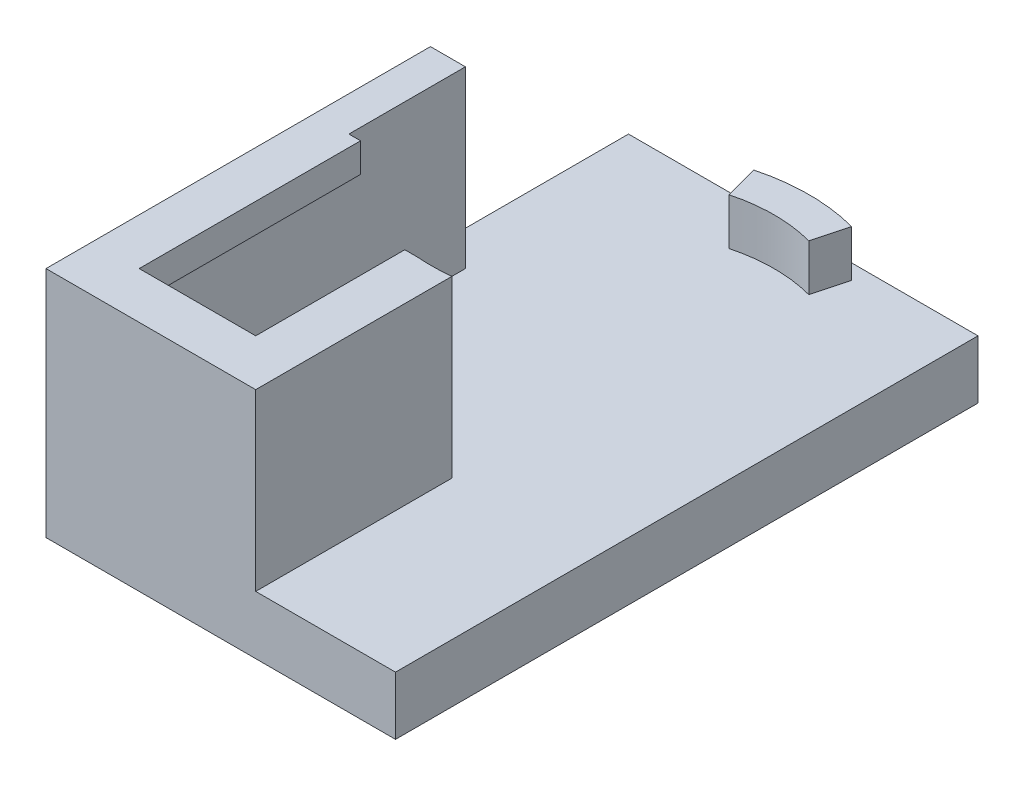
ISO-10303-21;
HEADER;
FILE_DESCRIPTION(('STEP AP214'),'2;1');
FILE_NAME('part.step','',(''),(''),'','','');
FILE_SCHEMA(('AUTOMOTIVE_DESIGN { 1 0 10303 214 1 1 1 1 }'));
ENDSEC;
DATA;
#1=APPLICATION_CONTEXT('core data for automotive mechanical design processes');
#2=APPLICATION_PROTOCOL_DEFINITION('international standard','automotive_design',2000,#1);
#3=PRODUCT_CONTEXT('',#1,'mechanical');
#4=PRODUCT('Part','Part','',(#3));
#5=PRODUCT_RELATED_PRODUCT_CATEGORY('part','',(#4));
#6=PRODUCT_DEFINITION_FORMATION('','',#4);
#7=PRODUCT_DEFINITION_CONTEXT('part definition',#1,'design');
#8=PRODUCT_DEFINITION('design','',#6,#7);
#9=PRODUCT_DEFINITION_SHAPE('','',#8);
#10=(LENGTH_UNIT() NAMED_UNIT(*) SI_UNIT(.MILLI.,.METRE.));
#11=(NAMED_UNIT(*) PLANE_ANGLE_UNIT() SI_UNIT($,.RADIAN.));
#12=(NAMED_UNIT(*) SI_UNIT($,.STERADIAN.) SOLID_ANGLE_UNIT());
#13=UNCERTAINTY_MEASURE_WITH_UNIT(LENGTH_MEASURE(1.E-05),#10,'distance_accuracy_value','');
#14=(GEOMETRIC_REPRESENTATION_CONTEXT(3) GLOBAL_UNCERTAINTY_ASSIGNED_CONTEXT((#13)) GLOBAL_UNIT_ASSIGNED_CONTEXT((#10,
#11,#12)) REPRESENTATION_CONTEXT('',''));
#15=CARTESIAN_POINT('',(0.,0.,0.));
#16=DIRECTION('',(0.,0.,1.));
#17=DIRECTION('',(1.,0.,0.));
#18=AXIS2_PLACEMENT_3D('',#15,#16,#17);
#19=CARTESIAN_POINT('',(0.,5.,0.));
#20=DIRECTION('',(0.,1.,0.));
#21=DIRECTION('',(0.,0.,1.));
#22=AXIS2_PLACEMENT_3D('',#19,#20,#21);
#23=PLANE('',#22);
#24=CARTESIAN_POINT('',(0.,5.,0.));
#25=DIRECTION('',(0.,1.,0.));
#26=DIRECTION('',(0.,0.,1.));
#27=AXIS2_PLACEMENT_3D('',#24,#25,#26);
#28=CIRCLE('',#27,13.25);
#29=CARTESIAN_POINT('',(3.4293523476084,5.,-12.7985171983302));
#30=VERTEX_POINT('',#29);
#31=CARTESIAN_POINT('',(-3.42935234760831,5.,-12.7985171983302));
#32=VERTEX_POINT('',#31);
#33=EDGE_CURVE('E315',#30,#32,#28,.T.);
#34=ORIENTED_EDGE('',*,*,#33,.T.);
#35=DIRECTION('',(0.258819045102514,0.,0.96592582628907));
#36=VECTOR('',#35,1.);
#37=CARTESIAN_POINT('',(0.,5.,0.));
#38=LINE('',#37,#36);
#39=CARTESIAN_POINT('',(-4.20580948291586,5.,-15.6962946771974));
#40=VERTEX_POINT('',#39);
#41=EDGE_CURVE('E324',#40,#32,#38,.T.);
#42=ORIENTED_EDGE('',*,*,#41,.F.);
#43=CARTESIAN_POINT('',(0.,5.,0.));
#44=DIRECTION('',(0.,1.,0.));
#45=DIRECTION('',(0.,0.,1.));
#46=AXIS2_PLACEMENT_3D('',#43,#44,#45);
#47=CIRCLE('',#46,16.25);
#48=CARTESIAN_POINT('',(4.20580948291597,5.,-15.6962946771974));
#49=VERTEX_POINT('',#48);
#50=EDGE_CURVE('E321',#49,#40,#47,.T.);
#51=ORIENTED_EDGE('',*,*,#50,.F.);
#52=DIRECTION('',(0.258819045102521,0.,-0.965925826289068));
#53=VECTOR('',#52,1.);
#54=CARTESIAN_POINT('',(0.,5.,0.));
#55=LINE('',#54,#53);
#56=EDGE_CURVE('E318',#30,#49,#55,.T.);
#57=ORIENTED_EDGE('',*,*,#56,.F.);
#58=EDGE_LOOP('',(#34,#42,#51,#57));
#59=FACE_BOUND('',#58,.T.);
#60=DIRECTION('',(0.,0.,-1.));
#61=VECTOR('',#60,1.);
#62=CARTESIAN_POINT('',(1.75,5.,0.));
#63=LINE('',#62,#61);
#64=CARTESIAN_POINT('',(1.75,5.,33.));
#65=VERTEX_POINT('',#64);
#66=CARTESIAN_POINT('',(1.75,5.,16.1554944214035));
#67=VERTEX_POINT('',#66);
#68=EDGE_CURVE('E275',#65,#67,#63,.T.);
#69=ORIENTED_EDGE('',*,*,#68,.F.);
#70=DIRECTION('',(1.,0.,0.));
#71=VECTOR('',#70,1.);
#72=CARTESIAN_POINT('',(0.,5.,33.));
#73=LINE('',#72,#71);
#74=CARTESIAN_POINT('',(13.75,5.,33.));
#75=VERTEX_POINT('',#74);
#76=EDGE_CURVE('E211',#65,#75,#73,.T.);
#77=ORIENTED_EDGE('',*,*,#76,.T.);
#78=DIRECTION('',(0.,0.,-1.));
#79=VECTOR('',#78,1.);
#80=CARTESIAN_POINT('',(13.75,5.,0.));
#81=LINE('',#80,#79);
#82=CARTESIAN_POINT('',(13.75,5.,-17.));
#83=VERTEX_POINT('',#82);
#84=EDGE_CURVE('E11',#75,#83,#81,.T.);
#85=ORIENTED_EDGE('',*,*,#84,.T.);
#86=DIRECTION('',(-1.,0.,0.));
#87=VECTOR('',#86,1.);
#88=CARTESIAN_POINT('',(0.,5.,-17.));
#89=LINE('',#88,#87);
#90=CARTESIAN_POINT('',(-16.25,5.,-17.));
#91=VERTEX_POINT('',#90);
#92=EDGE_CURVE('E46',#83,#91,#89,.T.);
#93=ORIENTED_EDGE('',*,*,#92,.T.);
#94=DIRECTION('',(0.,0.,1.));
#95=VECTOR('',#94,1.);
#96=CARTESIAN_POINT('',(-16.25,5.,0.));
#97=LINE('',#96,#95);
#98=CARTESIAN_POINT('',(-16.25,5.,0.));
#99=VERTEX_POINT('',#98);
#100=EDGE_CURVE('E208',#91,#99,#97,.T.);
#101=ORIENTED_EDGE('',*,*,#100,.T.);
#102=DIRECTION('',(-1.,0.,0.));
#103=VECTOR('',#102,1.);
#104=CARTESIAN_POINT('',(0.,5.,0.));
#105=LINE('',#104,#103);
#106=CARTESIAN_POINT('',(-13.25,5.,0.));
#107=VERTEX_POINT('',#106);
#108=EDGE_CURVE('E296',#107,#99,#105,.T.);
#109=ORIENTED_EDGE('',*,*,#108,.F.);
#110=DIRECTION('',(0.,0.,1.));
#111=VECTOR('',#110,1.);
#112=CARTESIAN_POINT('',(-13.25,5.,0.));
#113=LINE('',#112,#111);
#114=CARTESIAN_POINT('',(-13.25,5.,30.));
#115=VERTEX_POINT('',#114);
#116=EDGE_CURVE('E293',#107,#115,#113,.T.);
#117=ORIENTED_EDGE('',*,*,#116,.T.);
#118=DIRECTION('',(1.,0.,0.));
#119=VECTOR('',#118,1.);
#120=CARTESIAN_POINT('',(0.,5.,30.));
#121=LINE('',#120,#119);
#122=CARTESIAN_POINT('',(-1.25,5.,30.));
#123=VERTEX_POINT('',#122);
#124=EDGE_CURVE('E290',#115,#123,#121,.T.);
#125=ORIENTED_EDGE('',*,*,#124,.T.);
#126=DIRECTION('',(0.,0.,-1.));
#127=VECTOR('',#126,1.);
#128=CARTESIAN_POINT('',(-1.25,5.,0.));
#129=LINE('',#128,#127);
#130=CARTESIAN_POINT('',(-1.25,5.,16.2018517460196));
#131=VERTEX_POINT('',#130);
#132=EDGE_CURVE('E287',#123,#131,#129,.T.);
#133=ORIENTED_EDGE('',*,*,#132,.T.);
#134=CARTESIAN_POINT('',(0.,5.,0.));
#135=DIRECTION('',(0.,1.,0.));
#136=DIRECTION('',(0.,0.,1.));
#137=AXIS2_PLACEMENT_3D('',#134,#135,#136);
#138=CIRCLE('',#137,16.25);
#139=EDGE_CURVE('E270',#131,#67,#138,.T.);
#140=ORIENTED_EDGE('',*,*,#139,.T.);
#141=EDGE_LOOP('',(#69,#77,#85,#93,#101,#109,#117,#125,#133,#140));
#142=FACE_BOUND('',#141,.T.);
#143=ADVANCED_FACE('F38',(#59,#142),#23,.T.);
#144=CARTESIAN_POINT('',(0.,20.,0.));
#145=DIRECTION('',(0.,-1.,0.));
#146=DIRECTION('',(0.,0.,-1.));
#147=AXIS2_PLACEMENT_3D('',#144,#145,#146);
#148=CYLINDRICAL_SURFACE('',#147,13.25);
#149=DIRECTION('',(0.,-1.,0.));
#150=VECTOR('',#149,1.);
#151=CARTESIAN_POINT('',(3.4293523476084,20.,-12.7985171983302));
#152=LINE('',#151,#150);
#153=CARTESIAN_POINT('',(3.4293523476084,9.,-12.7985171983302));
#154=VERTEX_POINT('',#153);
#155=EDGE_CURVE('E333',#154,#30,#152,.T.);
#156=ORIENTED_EDGE('',*,*,#155,.F.);
#157=CARTESIAN_POINT('',(0.,9.,0.));
#158=DIRECTION('',(0.,1.,0.));
#159=DIRECTION('',(0.,0.,1.));
#160=AXIS2_PLACEMENT_3D('',#157,#158,#159);
#161=CIRCLE('',#160,13.25);
#162=CARTESIAN_POINT('',(-3.42935234760831,9.,-12.7985171983302));
#163=VERTEX_POINT('',#162);
#164=EDGE_CURVE('E218',#154,#163,#161,.T.);
#165=ORIENTED_EDGE('',*,*,#164,.T.);
#166=DIRECTION('',(0.,-1.,0.));
#167=VECTOR('',#166,1.);
#168=CARTESIAN_POINT('',(-3.42935234760831,20.,-12.7985171983302));
#169=LINE('',#168,#167);
#170=EDGE_CURVE('E327',#163,#32,#169,.T.);
#171=ORIENTED_EDGE('',*,*,#170,.T.);
#172=ORIENTED_EDGE('',*,*,#33,.F.);
#173=EDGE_LOOP('',(#156,#165,#171,#172));
#174=FACE_BOUND('',#173,.T.);
#175=ADVANCED_FACE('F400',(#174),#148,.F.);
#176=CARTESIAN_POINT('',(0.,20.,0.));
#177=DIRECTION('',(-0.965925826289068,0.,-0.258819045102521));
#178=DIRECTION('',(-0.258819045102521,0.,0.965925826289068));
#179=AXIS2_PLACEMENT_3D('',#176,#177,#178);
#180=PLANE('',#179);
#181=DIRECTION('',(0.258819045102521,0.,-0.965925826289068));
#182=VECTOR('',#181,1.);
#183=CARTESIAN_POINT('',(0.,9.,0.));
#184=LINE('',#183,#182);
#185=CARTESIAN_POINT('',(4.20580948291597,9.,-15.6962946771974));
#186=VERTEX_POINT('',#185);
#187=EDGE_CURVE('E216',#154,#186,#184,.T.);
#188=ORIENTED_EDGE('',*,*,#187,.F.);
#189=ORIENTED_EDGE('',*,*,#155,.T.);
#190=ORIENTED_EDGE('',*,*,#56,.T.);
#191=DIRECTION('',(0.,-1.,0.));
#192=VECTOR('',#191,1.);
#193=CARTESIAN_POINT('',(4.20580948291597,20.,-15.6962946771974));
#194=LINE('',#193,#192);
#195=EDGE_CURVE('E331',#186,#49,#194,.T.);
#196=ORIENTED_EDGE('',*,*,#195,.F.);
#197=EDGE_LOOP('',(#188,#189,#190,#196));
#198=FACE_BOUND('',#197,.T.);
#199=ADVANCED_FACE('F405',(#198),#180,.F.);
#200=CARTESIAN_POINT('',(0.,20.,0.));
#201=DIRECTION('',(0.,-1.,0.));
#202=DIRECTION('',(0.,0.,-1.));
#203=AXIS2_PLACEMENT_3D('',#200,#201,#202);
#204=CYLINDRICAL_SURFACE('',#203,16.25);
#205=CARTESIAN_POINT('',(0.,9.,0.));
#206=DIRECTION('',(0.,1.,0.));
#207=DIRECTION('',(0.,0.,1.));
#208=AXIS2_PLACEMENT_3D('',#205,#206,#207);
#209=CIRCLE('',#208,16.25);
#210=CARTESIAN_POINT('',(-4.20580948291586,9.,-15.6962946771974));
#211=VERTEX_POINT('',#210);
#212=EDGE_CURVE('E214',#186,#211,#209,.T.);
#213=ORIENTED_EDGE('',*,*,#212,.F.);
#214=ORIENTED_EDGE('',*,*,#195,.T.);
#215=ORIENTED_EDGE('',*,*,#50,.T.);
#216=DIRECTION('',(0.,-1.,0.));
#217=VECTOR('',#216,1.);
#218=CARTESIAN_POINT('',(-4.20580948291586,20.,-15.6962946771974));
#219=LINE('',#218,#217);
#220=EDGE_CURVE('E329',#211,#40,#219,.T.);
#221=ORIENTED_EDGE('',*,*,#220,.F.);
#222=EDGE_LOOP('',(#213,#214,#215,#221));
#223=FACE_BOUND('',#222,.T.);
#224=ADVANCED_FACE('F411',(#223),#204,.T.);
#225=CARTESIAN_POINT('',(0.,20.,0.));
#226=DIRECTION('',(0.96592582628907,0.,-0.258819045102514));
#227=DIRECTION('',(-0.258819045102514,0.,-0.96592582628907));
#228=AXIS2_PLACEMENT_3D('',#225,#226,#227);
#229=PLANE('',#228);
#230=DIRECTION('',(0.258819045102514,0.,0.96592582628907));
#231=VECTOR('',#230,1.);
#232=CARTESIAN_POINT('',(0.,9.,0.));
#233=LINE('',#232,#231);
#234=EDGE_CURVE('E335',#211,#163,#233,.T.);
#235=ORIENTED_EDGE('',*,*,#234,.F.);
#236=ORIENTED_EDGE('',*,*,#220,.T.);
#237=ORIENTED_EDGE('',*,*,#41,.T.);
#238=ORIENTED_EDGE('',*,*,#170,.F.);
#239=EDGE_LOOP('',(#235,#236,#237,#238));
#240=FACE_BOUND('',#239,.T.);
#241=ADVANCED_FACE('F415',(#240),#229,.F.);
#242=CARTESIAN_POINT('',(0.,20.,30.));
#243=DIRECTION('',(0.,0.,-1.));
#244=DIRECTION('',(-1.,0.,0.));
#245=AXIS2_PLACEMENT_3D('',#242,#243,#244);
#246=PLANE('',#245);
#247=DIRECTION('',(-1.,0.,0.));
#248=VECTOR('',#247,1.);
#249=CARTESIAN_POINT('',(-12.25,17.5,30.));
#250=LINE('',#249,#248);
#251=CARTESIAN_POINT('',(-1.25,17.5,30.));
#252=VERTEX_POINT('',#251);
#253=CARTESIAN_POINT('',(-13.25,17.5,30.));
#254=VERTEX_POINT('',#253);
#255=EDGE_CURVE('E267',#252,#254,#250,.T.);
#256=ORIENTED_EDGE('',*,*,#255,.F.);
#257=DIRECTION('',(0.,-1.,0.));
#258=VECTOR('',#257,1.);
#259=CARTESIAN_POINT('',(-1.25,20.,30.));
#260=LINE('',#259,#258);
#261=EDGE_CURVE('E309',#252,#123,#260,.T.);
#262=ORIENTED_EDGE('',*,*,#261,.T.);
#263=ORIENTED_EDGE('',*,*,#124,.F.);
#264=DIRECTION('',(0.,-1.,0.));
#265=VECTOR('',#264,1.);
#266=CARTESIAN_POINT('',(-13.25,20.,30.));
#267=LINE('',#266,#265);
#268=EDGE_CURVE('E307',#254,#115,#267,.T.);
#269=ORIENTED_EDGE('',*,*,#268,.F.);
#270=EDGE_LOOP('',(#256,#262,#263,#269));
#271=FACE_BOUND('',#270,.T.);
#272=ADVANCED_FACE('F363',(#271),#246,.T.);
#273=CARTESIAN_POINT('',(-1.25,20.,0.));
#274=DIRECTION('',(-1.,0.,0.));
#275=DIRECTION('',(0.,0.,1.));
#276=AXIS2_PLACEMENT_3D('',#273,#274,#275);
#277=PLANE('',#276);
#278=ORIENTED_EDGE('',*,*,#261,.F.);
#279=DIRECTION('',(0.,0.,1.));
#280=VECTOR('',#279,1.);
#281=CARTESIAN_POINT('',(-1.25,17.5,16.2018517460196));
#282=LINE('',#281,#280);
#283=CARTESIAN_POINT('',(-1.25,17.5,16.2018517460196));
#284=VERTEX_POINT('',#283);
#285=EDGE_CURVE('E233',#284,#252,#282,.T.);
#286=ORIENTED_EDGE('',*,*,#285,.F.);
#287=DIRECTION('',(0.,-1.,0.));
#288=VECTOR('',#287,1.);
#289=CARTESIAN_POINT('',(-1.25,20.,16.2018517460196));
#290=LINE('',#289,#288);
#291=EDGE_CURVE('E311',#284,#131,#290,.T.);
#292=ORIENTED_EDGE('',*,*,#291,.T.);
#293=ORIENTED_EDGE('',*,*,#132,.F.);
#294=EDGE_LOOP('',(#278,#286,#292,#293));
#295=FACE_BOUND('',#294,.T.);
#296=ADVANCED_FACE('F367',(#295),#277,.T.);
#297=CARTESIAN_POINT('',(-13.25,20.,0.));
#298=DIRECTION('',(1.,0.,0.));
#299=DIRECTION('',(0.,0.,-1.));
#300=AXIS2_PLACEMENT_3D('',#297,#298,#299);
#301=PLANE('',#300);
#302=DIRECTION('',(0.,1.,0.));
#303=VECTOR('',#302,1.);
#304=CARTESIAN_POINT('',(-13.25,20.,10.));
#305=LINE('',#304,#303);
#306=CARTESIAN_POINT('',(-13.25,17.5,10.));
#307=VERTEX_POINT('',#306);
#308=CARTESIAN_POINT('',(-13.25,20.,10.));
#309=VERTEX_POINT('',#308);
#310=EDGE_CURVE('E253',#307,#309,#305,.T.);
#311=ORIENTED_EDGE('',*,*,#310,.F.);
#312=DIRECTION('',(0.,0.,-1.));
#313=VECTOR('',#312,1.);
#314=CARTESIAN_POINT('',(-13.25,17.5,30.));
#315=LINE('',#314,#313);
#316=EDGE_CURVE('E249',#254,#307,#315,.T.);
#317=ORIENTED_EDGE('',*,*,#316,.F.);
#318=ORIENTED_EDGE('',*,*,#268,.T.);
#319=ORIENTED_EDGE('',*,*,#116,.F.);
#320=DIRECTION('',(0.,-1.,0.));
#321=VECTOR('',#320,1.);
#322=CARTESIAN_POINT('',(-13.25,20.,0.));
#323=LINE('',#322,#321);
#324=CARTESIAN_POINT('',(-13.25,20.,0.));
#325=VERTEX_POINT('',#324);
#326=EDGE_CURVE('E305',#325,#107,#323,.T.);
#327=ORIENTED_EDGE('',*,*,#326,.F.);
#328=DIRECTION('',(0.,0.,1.));
#329=VECTOR('',#328,1.);
#330=CARTESIAN_POINT('',(-13.25,20.,0.));
#331=LINE('',#330,#329);
#332=EDGE_CURVE('E274',#325,#309,#331,.T.);
#333=ORIENTED_EDGE('',*,*,#332,.T.);
#334=EDGE_LOOP('',(#311,#317,#318,#319,#327,#333));
#335=FACE_BOUND('',#334,.T.);
#336=ADVANCED_FACE('F360',(#335),#301,.T.);
#337=CARTESIAN_POINT('',(0.,20.,0.));
#338=DIRECTION('',(0.,-1.,0.));
#339=DIRECTION('',(0.,0.,-1.));
#340=AXIS2_PLACEMENT_3D('',#337,#338,#339);
#341=CYLINDRICAL_SURFACE('',#340,16.25);
#342=ORIENTED_EDGE('',*,*,#139,.F.);
#343=ORIENTED_EDGE('',*,*,#291,.F.);
#344=CARTESIAN_POINT('',(-1.25,20.,16.2018517460196));
#345=VERTEX_POINT('',#344);
#346=EDGE_CURVE('E312',#345,#284,#290,.T.);
#347=ORIENTED_EDGE('',*,*,#346,.F.);
#348=CARTESIAN_POINT('',(0.,20.,0.));
#349=DIRECTION('',(0.,1.,0.));
#350=DIRECTION('',(0.,0.,1.));
#351=AXIS2_PLACEMENT_3D('',#348,#349,#350);
#352=CIRCLE('',#351,16.25);
#353=CARTESIAN_POINT('',(1.75,20.,16.1554944214035));
#354=VERTEX_POINT('',#353);
#355=EDGE_CURVE('E271',#345,#354,#352,.T.);
#356=ORIENTED_EDGE('',*,*,#355,.T.);
#357=DIRECTION('',(0.,-1.,0.));
#358=VECTOR('',#357,1.);
#359=CARTESIAN_POINT('',(1.75,20.,16.1554944214035));
#360=LINE('',#359,#358);
#361=EDGE_CURVE('E284',#354,#67,#360,.T.);
#362=ORIENTED_EDGE('',*,*,#361,.T.);
#363=EDGE_LOOP('',(#342,#343,#347,#356,#362));
#364=FACE_BOUND('',#363,.T.);
#365=ADVANCED_FACE('F370',(#364),#341,.F.);
#366=CARTESIAN_POINT('',(0.,20.,0.));
#367=DIRECTION('',(0.,0.,1.));
#368=DIRECTION('',(1.,0.,0.));
#369=AXIS2_PLACEMENT_3D('',#366,#367,#368);
#370=PLANE('',#369);
#371=ORIENTED_EDGE('',*,*,#108,.T.);
#372=DIRECTION('',(0.,-1.,0.));
#373=VECTOR('',#372,1.);
#374=CARTESIAN_POINT('',(-16.25,20.,0.));
#375=LINE('',#374,#373);
#376=CARTESIAN_POINT('',(-16.25,20.,0.));
#377=VERTEX_POINT('',#376);
#378=EDGE_CURVE('E190',#377,#99,#375,.T.);
#379=ORIENTED_EDGE('',*,*,#378,.F.);
#380=DIRECTION('',(-1.,0.,0.));
#381=VECTOR('',#380,1.);
#382=CARTESIAN_POINT('',(0.,20.,0.));
#383=LINE('',#382,#381);
#384=EDGE_CURVE('E277',#325,#377,#383,.T.);
#385=ORIENTED_EDGE('',*,*,#384,.F.);
#386=ORIENTED_EDGE('',*,*,#326,.T.);
#387=EDGE_LOOP('',(#371,#379,#385,#386));
#388=FACE_BOUND('',#387,.T.);
#389=ADVANCED_FACE('F356',(#388),#370,.F.);
#390=CARTESIAN_POINT('',(-16.25,20.,0.));
#391=DIRECTION('',(1.,0.,0.));
#392=DIRECTION('',(0.,0.,-1.));
#393=AXIS2_PLACEMENT_3D('',#390,#391,#392);
#394=PLANE('',#393);
#395=ORIENTED_EDGE('',*,*,#378,.T.);
#396=ORIENTED_EDGE('',*,*,#100,.F.);
#397=DIRECTION('',(0.,1.,0.));
#398=VECTOR('',#397,1.);
#399=CARTESIAN_POINT('',(-16.25,0.,-17.));
#400=LINE('',#399,#398);
#401=CARTESIAN_POINT('',(-16.25,0.,-17.));
#402=VERTEX_POINT('',#401);
#403=EDGE_CURVE('E61',#402,#91,#400,.T.);
#404=ORIENTED_EDGE('',*,*,#403,.F.);
#405=DIRECTION('',(0.,0.,1.));
#406=VECTOR('',#405,1.);
#407=CARTESIAN_POINT('',(-16.25,0.,-17.));
#408=LINE('',#407,#406);
#409=CARTESIAN_POINT('',(-16.25,0.,33.));
#410=VERTEX_POINT('',#409);
#411=EDGE_CURVE('E194',#402,#410,#408,.T.);
#412=ORIENTED_EDGE('',*,*,#411,.T.);
#413=DIRECTION('',(0.,-1.,0.));
#414=VECTOR('',#413,1.);
#415=CARTESIAN_POINT('',(-16.25,20.,33.));
#416=LINE('',#415,#414);
#417=CARTESIAN_POINT('',(-16.25,20.,33.));
#418=VERTEX_POINT('',#417);
#419=EDGE_CURVE('E180',#418,#410,#416,.T.);
#420=ORIENTED_EDGE('',*,*,#419,.F.);
#421=DIRECTION('',(0.,0.,1.));
#422=VECTOR('',#421,1.);
#423=CARTESIAN_POINT('',(-16.25,20.,0.));
#424=LINE('',#423,#422);
#425=EDGE_CURVE('E279',#377,#418,#424,.T.);
#426=ORIENTED_EDGE('',*,*,#425,.F.);
#427=EDGE_LOOP('',(#395,#396,#404,#412,#420,#426));
#428=FACE_BOUND('',#427,.T.);
#429=ADVANCED_FACE('F196',(#428),#394,.F.);
#430=CARTESIAN_POINT('',(0.,20.,33.));
#431=DIRECTION('',(0.,0.,-1.));
#432=DIRECTION('',(-1.,0.,0.));
#433=AXIS2_PLACEMENT_3D('',#430,#431,#432);
#434=PLANE('',#433);
#435=ORIENTED_EDGE('',*,*,#419,.T.);
#436=DIRECTION('',(1.,0.,0.));
#437=VECTOR('',#436,1.);
#438=CARTESIAN_POINT('',(13.75,0.,33.));
#439=LINE('',#438,#437);
#440=CARTESIAN_POINT('',(13.75,0.,33.));
#441=VERTEX_POINT('',#440);
#442=EDGE_CURVE('E185',#410,#441,#439,.T.);
#443=ORIENTED_EDGE('',*,*,#442,.T.);
#444=DIRECTION('',(0.,1.,0.));
#445=VECTOR('',#444,1.);
#446=CARTESIAN_POINT('',(13.75,0.,33.));
#447=LINE('',#446,#445);
#448=EDGE_CURVE('E206',#441,#75,#447,.T.);
#449=ORIENTED_EDGE('',*,*,#448,.T.);
#450=ORIENTED_EDGE('',*,*,#76,.F.);
#451=DIRECTION('',(0.,-1.,0.));
#452=VECTOR('',#451,1.);
#453=CARTESIAN_POINT('',(1.75,20.,33.));
#454=LINE('',#453,#452);
#455=CARTESIAN_POINT('',(1.75,20.,33.));
#456=VERTEX_POINT('',#455);
#457=EDGE_CURVE('E191',#456,#65,#454,.T.);
#458=ORIENTED_EDGE('',*,*,#457,.F.);
#459=DIRECTION('',(1.,0.,0.));
#460=VECTOR('',#459,1.);
#461=CARTESIAN_POINT('',(0.,20.,33.));
#462=LINE('',#461,#460);
#463=EDGE_CURVE('E187',#418,#456,#462,.T.);
#464=ORIENTED_EDGE('',*,*,#463,.F.);
#465=EDGE_LOOP('',(#435,#443,#449,#450,#458,#464));
#466=FACE_BOUND('',#465,.T.);
#467=ADVANCED_FACE('F182',(#466),#434,.F.);
#468=CARTESIAN_POINT('',(1.75,20.,0.));
#469=DIRECTION('',(-1.,0.,0.));
#470=DIRECTION('',(0.,0.,1.));
#471=AXIS2_PLACEMENT_3D('',#468,#469,#470);
#472=PLANE('',#471);
#473=ORIENTED_EDGE('',*,*,#68,.T.);
#474=ORIENTED_EDGE('',*,*,#361,.F.);
#475=DIRECTION('',(0.,0.,-1.));
#476=VECTOR('',#475,1.);
#477=CARTESIAN_POINT('',(1.75,20.,0.));
#478=LINE('',#477,#476);
#479=EDGE_CURVE('E282',#456,#354,#478,.T.);
#480=ORIENTED_EDGE('',*,*,#479,.F.);
#481=ORIENTED_EDGE('',*,*,#457,.T.);
#482=EDGE_LOOP('',(#473,#474,#480,#481));
#483=FACE_BOUND('',#482,.T.);
#484=ADVANCED_FACE('F345',(#483),#472,.F.);
#485=CARTESIAN_POINT('',(0.,20.,0.));
#486=DIRECTION('',(0.,1.,0.));
#487=DIRECTION('',(0.,0.,1.));
#488=AXIS2_PLACEMENT_3D('',#485,#486,#487);
#489=PLANE('',#488);
#490=DIRECTION('',(1.,0.,0.));
#491=VECTOR('',#490,1.);
#492=CARTESIAN_POINT('',(-12.25,20.,29.));
#493=LINE('',#492,#491);
#494=CARTESIAN_POINT('',(-12.25,20.,29.));
#495=VERTEX_POINT('',#494);
#496=CARTESIAN_POINT('',(-2.25,20.,29.));
#497=VERTEX_POINT('',#496);
#498=EDGE_CURVE('E224',#495,#497,#493,.T.);
#499=ORIENTED_EDGE('',*,*,#498,.F.);
#500=DIRECTION('',(0.,0.,1.));
#501=VECTOR('',#500,1.);
#502=CARTESIAN_POINT('',(-12.25,20.,30.));
#503=LINE('',#502,#501);
#504=CARTESIAN_POINT('',(-12.25,20.,10.));
#505=VERTEX_POINT('',#504);
#506=EDGE_CURVE('E255',#505,#495,#503,.T.);
#507=ORIENTED_EDGE('',*,*,#506,.F.);
#508=DIRECTION('',(-1.,0.,0.));
#509=VECTOR('',#508,1.);
#510=CARTESIAN_POINT('',(-12.25,20.,10.));
#511=LINE('',#510,#509);
#512=EDGE_CURVE('E257',#505,#309,#511,.T.);
#513=ORIENTED_EDGE('',*,*,#512,.T.);
#514=ORIENTED_EDGE('',*,*,#332,.F.);
#515=ORIENTED_EDGE('',*,*,#384,.T.);
#516=ORIENTED_EDGE('',*,*,#425,.T.);
#517=ORIENTED_EDGE('',*,*,#463,.T.);
#518=ORIENTED_EDGE('',*,*,#479,.T.);
#519=ORIENTED_EDGE('',*,*,#355,.F.);
#520=DIRECTION('',(1.,0.,0.));
#521=VECTOR('',#520,1.);
#522=CARTESIAN_POINT('',(-2.25,20.,16.2018517460196));
#523=LINE('',#522,#521);
#524=CARTESIAN_POINT('',(-2.25,20.,16.2018517460196));
#525=VERTEX_POINT('',#524);
#526=EDGE_CURVE('E241',#525,#345,#523,.T.);
#527=ORIENTED_EDGE('',*,*,#526,.F.);
#528=DIRECTION('',(0.,0.,-1.));
#529=VECTOR('',#528,1.);
#530=CARTESIAN_POINT('',(-2.25,20.,16.2018517460196));
#531=LINE('',#530,#529);
#532=EDGE_CURVE('E239',#497,#525,#531,.T.);
#533=ORIENTED_EDGE('',*,*,#532,.F.);
#534=EDGE_LOOP('',(#499,#507,#513,#514,#515,#516,#517,#518,#519,#527,#533));
#535=FACE_BOUND('',#534,.T.);
#536=ADVANCED_FACE('F349',(#535),#489,.T.);
#537=CARTESIAN_POINT('',(-12.25,17.5,30.));
#538=DIRECTION('',(0.,1.,0.));
#539=DIRECTION('',(0.,0.,1.));
#540=AXIS2_PLACEMENT_3D('',#537,#538,#539);
#541=PLANE('',#540);
#542=ORIENTED_EDGE('',*,*,#316,.T.);
#543=DIRECTION('',(-1.,0.,0.));
#544=VECTOR('',#543,1.);
#545=CARTESIAN_POINT('',(-12.25,17.5,10.));
#546=LINE('',#545,#544);
#547=CARTESIAN_POINT('',(-12.25,17.5,10.));
#548=VERTEX_POINT('',#547);
#549=EDGE_CURVE('E264',#548,#307,#546,.T.);
#550=ORIENTED_EDGE('',*,*,#549,.F.);
#551=DIRECTION('',(0.,0.,-1.));
#552=VECTOR('',#551,1.);
#553=CARTESIAN_POINT('',(-12.25,17.5,30.));
#554=LINE('',#553,#552);
#555=CARTESIAN_POINT('',(-12.25,17.5,29.));
#556=VERTEX_POINT('',#555);
#557=EDGE_CURVE('E250',#556,#548,#554,.T.);
#558=ORIENTED_EDGE('',*,*,#557,.F.);
#559=DIRECTION('',(-1.,0.,0.));
#560=VECTOR('',#559,1.);
#561=CARTESIAN_POINT('',(-12.25,17.5,29.));
#562=LINE('',#561,#560);
#563=CARTESIAN_POINT('',(-2.25,17.5,29.));
#564=VERTEX_POINT('',#563);
#565=EDGE_CURVE('E230',#564,#556,#562,.T.);
#566=ORIENTED_EDGE('',*,*,#565,.F.);
#567=DIRECTION('',(0.,0.,1.));
#568=VECTOR('',#567,1.);
#569=CARTESIAN_POINT('',(-2.25,17.5,16.2018517460196));
#570=LINE('',#569,#568);
#571=CARTESIAN_POINT('',(-2.25,17.5,16.2018517460196));
#572=VERTEX_POINT('',#571);
#573=EDGE_CURVE('E237',#572,#564,#570,.T.);
#574=ORIENTED_EDGE('',*,*,#573,.F.);
#575=DIRECTION('',(1.,0.,0.));
#576=VECTOR('',#575,1.);
#577=CARTESIAN_POINT('',(-2.25,17.5,16.2018517460196));
#578=LINE('',#577,#576);
#579=EDGE_CURVE('E246',#572,#284,#578,.T.);
#580=ORIENTED_EDGE('',*,*,#579,.T.);
#581=ORIENTED_EDGE('',*,*,#285,.T.);
#582=ORIENTED_EDGE('',*,*,#255,.T.);
#583=EDGE_LOOP('',(#542,#550,#558,#566,#574,#580,#581,#582));
#584=FACE_BOUND('',#583,.T.);
#585=ADVANCED_FACE('F386',(#584),#541,.F.);
#586=CARTESIAN_POINT('',(-12.25,20.,10.));
#587=DIRECTION('',(0.,0.,1.));
#588=DIRECTION('',(0.,-1.,0.));
#589=AXIS2_PLACEMENT_3D('',#586,#587,#588);
#590=PLANE('',#589);
#591=ORIENTED_EDGE('',*,*,#310,.T.);
#592=ORIENTED_EDGE('',*,*,#512,.F.);
#593=DIRECTION('',(0.,1.,0.));
#594=VECTOR('',#593,1.);
#595=CARTESIAN_POINT('',(-12.25,20.,10.));
#596=LINE('',#595,#594);
#597=EDGE_CURVE('E252',#548,#505,#596,.T.);
#598=ORIENTED_EDGE('',*,*,#597,.F.);
#599=ORIENTED_EDGE('',*,*,#549,.T.);
#600=EDGE_LOOP('',(#591,#592,#598,#599));
#601=FACE_BOUND('',#600,.T.);
#602=ADVANCED_FACE('F390',(#601),#590,.F.);
#603=CARTESIAN_POINT('',(-12.25,0.,0.));
#604=DIRECTION('',(1.,0.,0.));
#605=DIRECTION('',(0.,0.,-1.));
#606=AXIS2_PLACEMENT_3D('',#603,#604,#605);
#607=PLANE('',#606);
#608=DIRECTION('',(0.,1.,0.));
#609=VECTOR('',#608,1.);
#610=CARTESIAN_POINT('',(-12.25,17.5,29.));
#611=LINE('',#610,#609);
#612=EDGE_CURVE('E221',#556,#495,#611,.T.);
#613=ORIENTED_EDGE('',*,*,#612,.F.);
#614=ORIENTED_EDGE('',*,*,#557,.T.);
#615=ORIENTED_EDGE('',*,*,#597,.T.);
#616=ORIENTED_EDGE('',*,*,#506,.T.);
#617=EDGE_LOOP('',(#613,#614,#615,#616));
#618=FACE_BOUND('',#617,.T.);
#619=ADVANCED_FACE('F383',(#618),#607,.T.);
#620=CARTESIAN_POINT('',(-2.25,20.,16.2018517460196));
#621=DIRECTION('',(0.,0.,1.));
#622=DIRECTION('',(1.,0.,0.));
#623=AXIS2_PLACEMENT_3D('',#620,#621,#622);
#624=PLANE('',#623);
#625=ORIENTED_EDGE('',*,*,#346,.T.);
#626=ORIENTED_EDGE('',*,*,#579,.F.);
#627=DIRECTION('',(0.,-1.,0.));
#628=VECTOR('',#627,1.);
#629=CARTESIAN_POINT('',(-2.25,20.,16.2018517460196));
#630=LINE('',#629,#628);
#631=EDGE_CURVE('E234',#525,#572,#630,.T.);
#632=ORIENTED_EDGE('',*,*,#631,.F.);
#633=ORIENTED_EDGE('',*,*,#526,.T.);
#634=EDGE_LOOP('',(#625,#626,#632,#633));
#635=FACE_BOUND('',#634,.T.);
#636=ADVANCED_FACE('F374',(#635),#624,.F.);
#637=CARTESIAN_POINT('',(-2.25,0.,0.));
#638=DIRECTION('',(-1.,0.,0.));
#639=DIRECTION('',(0.,0.,1.));
#640=AXIS2_PLACEMENT_3D('',#637,#638,#639);
#641=PLANE('',#640);
#642=DIRECTION('',(0.,-1.,0.));
#643=VECTOR('',#642,1.);
#644=CARTESIAN_POINT('',(-2.25,17.5,29.));
#645=LINE('',#644,#643);
#646=EDGE_CURVE('E227',#497,#564,#645,.T.);
#647=ORIENTED_EDGE('',*,*,#646,.F.);
#648=ORIENTED_EDGE('',*,*,#532,.T.);
#649=ORIENTED_EDGE('',*,*,#631,.T.);
#650=ORIENTED_EDGE('',*,*,#573,.T.);
#651=EDGE_LOOP('',(#647,#648,#649,#650));
#652=FACE_BOUND('',#651,.T.);
#653=ADVANCED_FACE('F462',(#652),#641,.T.);
#654=CARTESIAN_POINT('',(0.,0.,29.));
#655=DIRECTION('',(0.,0.,-1.));
#656=DIRECTION('',(-1.,0.,0.));
#657=AXIS2_PLACEMENT_3D('',#654,#655,#656);
#658=PLANE('',#657);
#659=ORIENTED_EDGE('',*,*,#612,.T.);
#660=ORIENTED_EDGE('',*,*,#498,.T.);
#661=ORIENTED_EDGE('',*,*,#646,.T.);
#662=ORIENTED_EDGE('',*,*,#565,.T.);
#663=EDGE_LOOP('',(#659,#660,#661,#662));
#664=FACE_BOUND('',#663,.T.);
#665=ADVANCED_FACE('F379',(#664),#658,.T.);
#666=CARTESIAN_POINT('',(0.,9.,0.));
#667=DIRECTION('',(0.,1.,0.));
#668=DIRECTION('',(0.,0.,1.));
#669=AXIS2_PLACEMENT_3D('',#666,#667,#668);
#670=PLANE('',#669);
#671=ORIENTED_EDGE('',*,*,#187,.T.);
#672=ORIENTED_EDGE('',*,*,#212,.T.);
#673=ORIENTED_EDGE('',*,*,#234,.T.);
#674=ORIENTED_EDGE('',*,*,#164,.F.);
#675=EDGE_LOOP('',(#671,#672,#673,#674));
#676=FACE_BOUND('',#675,.T.);
#677=ADVANCED_FACE('F476',(#676),#670,.T.);
#678=CARTESIAN_POINT('',(13.75,0.,-17.));
#679=DIRECTION('',(1.,0.,0.));
#680=DIRECTION('',(0.,0.,-1.));
#681=AXIS2_PLACEMENT_3D('',#678,#679,#680);
#682=PLANE('',#681);
#683=ORIENTED_EDGE('',*,*,#448,.F.);
#684=DIRECTION('',(0.,0.,-1.));
#685=VECTOR('',#684,1.);
#686=CARTESIAN_POINT('',(13.75,0.,-17.));
#687=LINE('',#686,#685);
#688=CARTESIAN_POINT('',(13.75,0.,-17.));
#689=VERTEX_POINT('',#688);
#690=EDGE_CURVE('E53',#441,#689,#687,.T.);
#691=ORIENTED_EDGE('',*,*,#690,.T.);
#692=DIRECTION('',(0.,1.,0.));
#693=VECTOR('',#692,1.);
#694=CARTESIAN_POINT('',(13.75,0.,-17.));
#695=LINE('',#694,#693);
#696=EDGE_CURVE('E201',#689,#83,#695,.T.);
#697=ORIENTED_EDGE('',*,*,#696,.T.);
#698=ORIENTED_EDGE('',*,*,#84,.F.);
#699=EDGE_LOOP('',(#683,#691,#697,#698));
#700=FACE_BOUND('',#699,.T.);
#701=ADVANCED_FACE('F341',(#700),#682,.T.);
#702=CARTESIAN_POINT('',(13.75,0.,-17.));
#703=DIRECTION('',(0.,0.,-1.));
#704=DIRECTION('',(-1.,0.,0.));
#705=AXIS2_PLACEMENT_3D('',#702,#703,#704);
#706=PLANE('',#705);
#707=ORIENTED_EDGE('',*,*,#696,.F.);
#708=DIRECTION('',(-1.,0.,0.));
#709=VECTOR('',#708,1.);
#710=CARTESIAN_POINT('',(13.75,0.,-17.));
#711=LINE('',#710,#709);
#712=EDGE_CURVE('E199',#689,#402,#711,.T.);
#713=ORIENTED_EDGE('',*,*,#712,.T.);
#714=ORIENTED_EDGE('',*,*,#403,.T.);
#715=ORIENTED_EDGE('',*,*,#92,.F.);
#716=EDGE_LOOP('',(#707,#713,#714,#715));
#717=FACE_BOUND('',#716,.T.);
#718=ADVANCED_FACE('F340',(#717),#706,.T.);
#719=CARTESIAN_POINT('',(0.,0.,0.));
#720=DIRECTION('',(0.,1.,0.));
#721=DIRECTION('',(0.,0.,1.));
#722=AXIS2_PLACEMENT_3D('',#719,#720,#721);
#723=PLANE('',#722);
#724=ORIENTED_EDGE('',*,*,#690,.F.);
#725=ORIENTED_EDGE('',*,*,#442,.F.);
#726=ORIENTED_EDGE('',*,*,#411,.F.);
#727=ORIENTED_EDGE('',*,*,#712,.F.);
#728=EDGE_LOOP('',(#724,#725,#726,#727));
#729=FACE_BOUND('',#728,.T.);
#730=ADVANCED_FACE('F40',(#729),#723,.F.);
#731=CLOSED_SHELL('',(#143,#175,#199,#224,#241,#272,#296,#336,#365,#389,#429,#467,#484,#536,
#585,#602,#619,#636,#653,#665,#677,#701,#718,#730));
#732=MANIFOLD_SOLID_BREP('B2',#731);
#733=ADVANCED_BREP_SHAPE_REPRESENTATION('',(#18,#732),#14);
#734=SHAPE_DEFINITION_REPRESENTATION(#9,#733);
ENDSEC;
END-ISO-10303-21;
